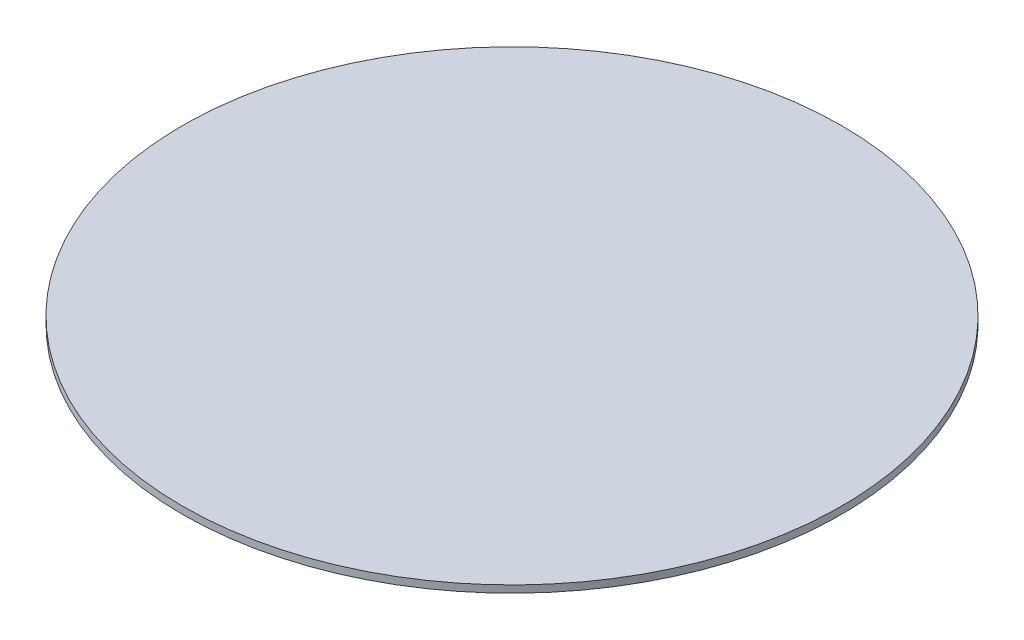
ISO-10303-21;
HEADER;
FILE_DESCRIPTION(('STEP AP214'),'2;1');
FILE_NAME('part.step','',(''),(''),'','','');
FILE_SCHEMA(('AUTOMOTIVE_DESIGN { 1 0 10303 214 1 1 1 1 }'));
ENDSEC;
DATA;
#1=APPLICATION_CONTEXT('core data for automotive mechanical design processes');
#2=APPLICATION_PROTOCOL_DEFINITION('international standard','automotive_design',2000,#1);
#3=PRODUCT_CONTEXT('',#1,'mechanical');
#4=PRODUCT('Part','Part','',(#3));
#5=PRODUCT_RELATED_PRODUCT_CATEGORY('part','',(#4));
#6=PRODUCT_DEFINITION_FORMATION('','',#4);
#7=PRODUCT_DEFINITION_CONTEXT('part definition',#1,'design');
#8=PRODUCT_DEFINITION('design','',#6,#7);
#9=PRODUCT_DEFINITION_SHAPE('','',#8);
#10=(LENGTH_UNIT() NAMED_UNIT(*) SI_UNIT(.MILLI.,.METRE.));
#11=(NAMED_UNIT(*) PLANE_ANGLE_UNIT() SI_UNIT($,.RADIAN.));
#12=(NAMED_UNIT(*) SI_UNIT($,.STERADIAN.) SOLID_ANGLE_UNIT());
#13=UNCERTAINTY_MEASURE_WITH_UNIT(LENGTH_MEASURE(1.E-05),#10,'distance_accuracy_value','');
#14=(GEOMETRIC_REPRESENTATION_CONTEXT(3) GLOBAL_UNCERTAINTY_ASSIGNED_CONTEXT((#13)) GLOBAL_UNIT_ASSIGNED_CONTEXT((#10,
#11,#12)) REPRESENTATION_CONTEXT('',''));
#15=CARTESIAN_POINT('',(0.,0.,0.));
#16=DIRECTION('',(0.,0.,1.));
#17=DIRECTION('',(1.,0.,0.));
#18=AXIS2_PLACEMENT_3D('',#15,#16,#17);
#19=CARTESIAN_POINT('',(0.,0.5,0.));
#20=DIRECTION('',(0.,-1.,0.));
#21=DIRECTION('',(0.,0.,-1.));
#22=AXIS2_PLACEMENT_3D('',#19,#20,#21);
#23=CYLINDRICAL_SURFACE('',#22,23.);
#24=CARTESIAN_POINT('',(0.,0.5,0.));
#25=DIRECTION('',(0.,1.,0.));
#26=DIRECTION('',(0.,0.,1.));
#27=AXIS2_PLACEMENT_3D('',#24,#25,#26);
#28=CIRCLE('',#27,23.);
#29=CARTESIAN_POINT('',(0.,0.5,23.));
#30=VERTEX_POINT('',#29);
#31=EDGE_CURVE('E10',#30,#30,#28,.T.);
#32=ORIENTED_EDGE('',*,*,#31,.F.);
#33=EDGE_LOOP('',(#32));
#34=FACE_BOUND('',#33,.T.);
#35=CARTESIAN_POINT('',(0.,0.,0.));
#36=DIRECTION('',(0.,1.,0.));
#37=DIRECTION('',(0.,0.,1.));
#38=AXIS2_PLACEMENT_3D('',#35,#36,#37);
#39=CIRCLE('',#38,23.);
#40=CARTESIAN_POINT('',(0.,0.,23.));
#41=VERTEX_POINT('',#40);
#42=EDGE_CURVE('E40',#41,#41,#39,.T.);
#43=ORIENTED_EDGE('',*,*,#42,.T.);
#44=EDGE_LOOP('',(#43));
#45=FACE_BOUND('',#44,.T.);
#46=ADVANCED_FACE('F37',(#34,#45),#23,.T.);
#47=CARTESIAN_POINT('',(0.,0.5,0.));
#48=DIRECTION('',(0.,1.,0.));
#49=DIRECTION('',(0.,0.,1.));
#50=AXIS2_PLACEMENT_3D('',#47,#48,#49);
#51=PLANE('',#50);
#52=ORIENTED_EDGE('',*,*,#31,.T.);
#53=EDGE_LOOP('',(#52));
#54=FACE_BOUND('',#53,.T.);
#55=ADVANCED_FACE('F54',(#54),#51,.T.);
#56=CARTESIAN_POINT('',(0.,0.,0.));
#57=DIRECTION('',(0.,1.,0.));
#58=DIRECTION('',(0.,0.,1.));
#59=AXIS2_PLACEMENT_3D('',#56,#57,#58);
#60=PLANE('',#59);
#61=ORIENTED_EDGE('',*,*,#42,.F.);
#62=EDGE_LOOP('',(#61));
#63=FACE_BOUND('',#62,.T.);
#64=ADVANCED_FACE('F52',(#63),#60,.F.);
#65=CLOSED_SHELL('',(#46,#55,#64));
#66=MANIFOLD_SOLID_BREP('B2',#65);
#67=ADVANCED_BREP_SHAPE_REPRESENTATION('',(#18,#66),#14);
#68=SHAPE_DEFINITION_REPRESENTATION(#9,#67);
ENDSEC;
END-ISO-10303-21;
